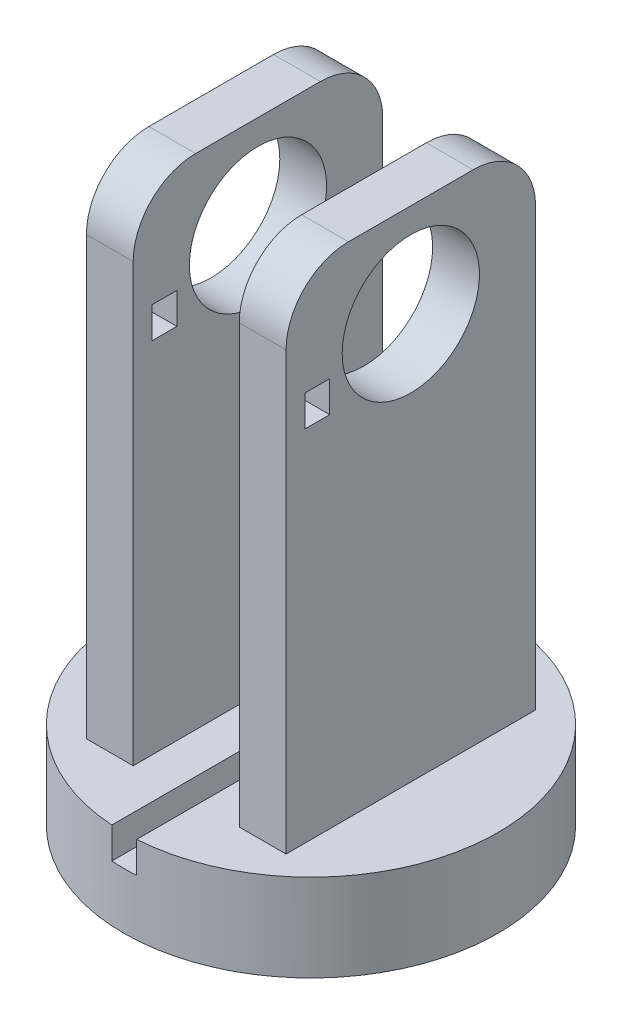
ISO-10303-21;
HEADER;
FILE_DESCRIPTION(('STEP AP214'),'2;1');
FILE_NAME('part.step','',(''),(''),'','','');
FILE_SCHEMA(('AUTOMOTIVE_DESIGN { 1 0 10303 214 1 1 1 1 }'));
ENDSEC;
DATA;
#1=APPLICATION_CONTEXT('core data for automotive mechanical design processes');
#2=APPLICATION_PROTOCOL_DEFINITION('international standard','automotive_design',2000,#1);
#3=PRODUCT_CONTEXT('',#1,'mechanical');
#4=PRODUCT('Part','Part','',(#3));
#5=PRODUCT_RELATED_PRODUCT_CATEGORY('part','',(#4));
#6=PRODUCT_DEFINITION_FORMATION('','',#4);
#7=PRODUCT_DEFINITION_CONTEXT('part definition',#1,'design');
#8=PRODUCT_DEFINITION('design','',#6,#7);
#9=PRODUCT_DEFINITION_SHAPE('','',#8);
#10=(LENGTH_UNIT() NAMED_UNIT(*) SI_UNIT(.MILLI.,.METRE.));
#11=(NAMED_UNIT(*) PLANE_ANGLE_UNIT() SI_UNIT($,.RADIAN.));
#12=(NAMED_UNIT(*) SI_UNIT($,.STERADIAN.) SOLID_ANGLE_UNIT());
#13=UNCERTAINTY_MEASURE_WITH_UNIT(LENGTH_MEASURE(1.E-05),#10,'distance_accuracy_value','');
#14=(GEOMETRIC_REPRESENTATION_CONTEXT(3) GLOBAL_UNCERTAINTY_ASSIGNED_CONTEXT((#13)) GLOBAL_UNIT_ASSIGNED_CONTEXT((#10,
#11,#12)) REPRESENTATION_CONTEXT('',''));
#15=CARTESIAN_POINT('',(0.,0.,0.));
#16=DIRECTION('',(0.,0.,1.));
#17=DIRECTION('',(1.,0.,0.));
#18=AXIS2_PLACEMENT_3D('',#15,#16,#17);
#19=CARTESIAN_POINT('',(0.,14.,0.));
#20=DIRECTION('',(0.,1.,0.));
#21=DIRECTION('',(0.,0.,1.));
#22=AXIS2_PLACEMENT_3D('',#19,#20,#21);
#23=PLANE('',#22);
#24=DIRECTION('',(0.,0.,-1.));
#25=VECTOR('',#24,1.);
#26=CARTESIAN_POINT('',(2.,14.,-29.9332590941915));
#27=LINE('',#26,#25);
#28=CARTESIAN_POINT('',(2.,14.,29.9332590941915));
#29=VERTEX_POINT('',#28);
#30=CARTESIAN_POINT('',(2.,14.,-29.9332590941915));
#31=VERTEX_POINT('',#30);
#32=EDGE_CURVE('E246',#29,#31,#27,.T.);
#33=ORIENTED_EDGE('',*,*,#32,.F.);
#34=CARTESIAN_POINT('',(0.,14.,0.));
#35=DIRECTION('',(0.,1.,0.));
#36=DIRECTION('',(0.,0.,1.));
#37=AXIS2_PLACEMENT_3D('',#34,#35,#36);
#38=CIRCLE('',#37,30.);
#39=EDGE_CURVE('E334',#29,#31,#38,.T.);
#40=ORIENTED_EDGE('',*,*,#39,.T.);
#41=EDGE_LOOP('',(#33,#40));
#42=FACE_BOUND('',#41,.T.);
#43=DIRECTION('',(0.,0.,-1.));
#44=VECTOR('',#43,1.);
#45=CARTESIAN_POINT('',(16.,14.,20.));
#46=LINE('',#45,#44);
#47=CARTESIAN_POINT('',(16.,14.,20.));
#48=VERTEX_POINT('',#47);
#49=CARTESIAN_POINT('',(16.,14.,-20.));
#50=VERTEX_POINT('',#49);
#51=EDGE_CURVE('E286',#48,#50,#46,.T.);
#52=ORIENTED_EDGE('',*,*,#51,.F.);
#53=DIRECTION('',(1.,0.,0.));
#54=VECTOR('',#53,1.);
#55=CARTESIAN_POINT('',(8.5,14.,20.));
#56=LINE('',#55,#54);
#57=CARTESIAN_POINT('',(8.5,14.,20.));
#58=VERTEX_POINT('',#57);
#59=EDGE_CURVE('E275',#58,#48,#56,.T.);
#60=ORIENTED_EDGE('',*,*,#59,.F.);
#61=DIRECTION('',(0.,0.,1.));
#62=VECTOR('',#61,1.);
#63=CARTESIAN_POINT('',(8.5,14.,-20.));
#64=LINE('',#63,#62);
#65=CARTESIAN_POINT('',(8.5,14.,-20.));
#66=VERTEX_POINT('',#65);
#67=EDGE_CURVE('E280',#66,#58,#64,.T.);
#68=ORIENTED_EDGE('',*,*,#67,.F.);
#69=DIRECTION('',(-1.,0.,0.));
#70=VECTOR('',#69,1.);
#71=CARTESIAN_POINT('',(16.,14.,-20.));
#72=LINE('',#71,#70);
#73=EDGE_CURVE('E289',#50,#66,#72,.T.);
#74=ORIENTED_EDGE('',*,*,#73,.F.);
#75=EDGE_LOOP('',(#52,#60,#68,#74));
#76=FACE_BOUND('',#75,.T.);
#77=ADVANCED_FACE('F33',(#42,#76),#23,.T.);
#78=DIRECTION('',(0.,0.,1.));
#79=VECTOR('',#78,1.);
#80=CARTESIAN_POINT('',(-2.,14.,-29.9332590941915));
#81=LINE('',#80,#79);
#82=CARTESIAN_POINT('',(-2.,14.,-29.9332590941915));
#83=VERTEX_POINT('',#82);
#84=CARTESIAN_POINT('',(-2.,14.,29.9332590941915));
#85=VERTEX_POINT('',#84);
#86=EDGE_CURVE('E241',#83,#85,#81,.T.);
#87=ORIENTED_EDGE('',*,*,#86,.F.);
#88=EDGE_CURVE('E338',#83,#85,#38,.T.);
#89=ORIENTED_EDGE('',*,*,#88,.T.);
#90=EDGE_LOOP('',(#87,#89));
#91=FACE_BOUND('',#90,.T.);
#92=DIRECTION('',(0.,0.,-1.));
#93=VECTOR('',#92,1.);
#94=CARTESIAN_POINT('',(-8.5,14.,20.));
#95=LINE('',#94,#93);
#96=CARTESIAN_POINT('',(-8.5,14.,20.));
#97=VERTEX_POINT('',#96);
#98=CARTESIAN_POINT('',(-8.5,14.,-20.));
#99=VERTEX_POINT('',#98);
#100=EDGE_CURVE('E312',#97,#99,#95,.T.);
#101=ORIENTED_EDGE('',*,*,#100,.F.);
#102=DIRECTION('',(1.,0.,0.));
#103=VECTOR('',#102,1.);
#104=CARTESIAN_POINT('',(-16.,14.,20.));
#105=LINE('',#104,#103);
#106=CARTESIAN_POINT('',(-16.,14.,20.));
#107=VERTEX_POINT('',#106);
#108=EDGE_CURVE('E301',#107,#97,#105,.T.);
#109=ORIENTED_EDGE('',*,*,#108,.F.);
#110=DIRECTION('',(0.,0.,1.));
#111=VECTOR('',#110,1.);
#112=CARTESIAN_POINT('',(-16.,14.,-20.));
#113=LINE('',#112,#111);
#114=CARTESIAN_POINT('',(-16.,14.,-20.));
#115=VERTEX_POINT('',#114);
#116=EDGE_CURVE('E306',#115,#107,#113,.T.);
#117=ORIENTED_EDGE('',*,*,#116,.F.);
#118=DIRECTION('',(-1.,0.,0.));
#119=VECTOR('',#118,1.);
#120=CARTESIAN_POINT('',(-8.5,14.,-20.));
#121=LINE('',#120,#119);
#122=EDGE_CURVE('E315',#99,#115,#121,.T.);
#123=ORIENTED_EDGE('',*,*,#122,.F.);
#124=EDGE_LOOP('',(#101,#109,#117,#123));
#125=FACE_BOUND('',#124,.T.);
#126=ADVANCED_FACE('F450',(#91,#125),#23,.T.);
#127=CARTESIAN_POINT('',(0.,14.,0.));
#128=DIRECTION('',(0.,-1.,0.));
#129=DIRECTION('',(0.,0.,-1.));
#130=AXIS2_PLACEMENT_3D('',#127,#128,#129);
#131=CYLINDRICAL_SURFACE('',#130,30.);
#132=CARTESIAN_POINT('',(0.,9.,0.));
#133=DIRECTION('',(0.,1.,0.));
#134=DIRECTION('',(0.,0.,1.));
#135=AXIS2_PLACEMENT_3D('',#132,#133,#134);
#136=CIRCLE('',#135,30.);
#137=CARTESIAN_POINT('',(2.,9.,-29.9332590941915));
#138=VERTEX_POINT('',#137);
#139=CARTESIAN_POINT('',(-2.,9.,-29.9332590941915));
#140=VERTEX_POINT('',#139);
#141=EDGE_CURVE('E242',#138,#140,#136,.T.);
#142=ORIENTED_EDGE('',*,*,#141,.F.);
#143=DIRECTION('',(0.,1.,0.));
#144=VECTOR('',#143,1.);
#145=CARTESIAN_POINT('',(2.,9.,-29.9332590941915));
#146=LINE('',#145,#144);
#147=EDGE_CURVE('E256',#138,#31,#146,.T.);
#148=ORIENTED_EDGE('',*,*,#147,.T.);
#149=ORIENTED_EDGE('',*,*,#39,.F.);
#150=DIRECTION('',(0.,1.,0.));
#151=VECTOR('',#150,1.);
#152=CARTESIAN_POINT('',(2.,9.,29.9332590941915));
#153=LINE('',#152,#151);
#154=CARTESIAN_POINT('',(2.,9.,29.9332590941915));
#155=VERTEX_POINT('',#154);
#156=EDGE_CURVE('E260',#155,#29,#153,.T.);
#157=ORIENTED_EDGE('',*,*,#156,.F.);
#158=CARTESIAN_POINT('',(0.,9.,0.));
#159=DIRECTION('',(0.,1.,0.));
#160=DIRECTION('',(0.,0.,1.));
#161=AXIS2_PLACEMENT_3D('',#158,#159,#160);
#162=CIRCLE('',#161,30.);
#163=CARTESIAN_POINT('',(-2.,9.,29.9332590941915));
#164=VERTEX_POINT('',#163);
#165=EDGE_CURVE('E248',#164,#155,#162,.T.);
#166=ORIENTED_EDGE('',*,*,#165,.F.);
#167=DIRECTION('',(0.,1.,0.));
#168=VECTOR('',#167,1.);
#169=CARTESIAN_POINT('',(-2.,9.,29.9332590941915));
#170=LINE('',#169,#168);
#171=EDGE_CURVE('E262',#164,#85,#170,.T.);
#172=ORIENTED_EDGE('',*,*,#171,.T.);
#173=ORIENTED_EDGE('',*,*,#88,.F.);
#174=DIRECTION('',(0.,1.,0.));
#175=VECTOR('',#174,1.);
#176=CARTESIAN_POINT('',(-2.,9.,-29.9332590941915));
#177=LINE('',#176,#175);
#178=EDGE_CURVE('E253',#140,#83,#177,.T.);
#179=ORIENTED_EDGE('',*,*,#178,.F.);
#180=EDGE_LOOP('',(#142,#148,#149,#157,#166,#172,#173,#179));
#181=FACE_BOUND('',#180,.T.);
#182=CARTESIAN_POINT('',(0.,0.,0.));
#183=DIRECTION('',(0.,1.,0.));
#184=DIRECTION('',(0.,0.,1.));
#185=AXIS2_PLACEMENT_3D('',#182,#183,#184);
#186=CIRCLE('',#185,30.);
#187=CARTESIAN_POINT('',(0.,0.,30.));
#188=VERTEX_POINT('',#187);
#189=EDGE_CURVE('E331',#188,#188,#186,.T.);
#190=ORIENTED_EDGE('',*,*,#189,.T.);
#191=EDGE_LOOP('',(#190));
#192=FACE_BOUND('',#191,.T.);
#193=ADVANCED_FACE('F456',(#181,#192),#131,.T.);
#194=CARTESIAN_POINT('',(0.,0.,0.));
#195=DIRECTION('',(0.,1.,0.));
#196=DIRECTION('',(0.,0.,1.));
#197=AXIS2_PLACEMENT_3D('',#194,#195,#196);
#198=PLANE('',#197);
#199=CARTESIAN_POINT('',(0.,0.,0.));
#200=DIRECTION('',(0.,-1.,0.));
#201=DIRECTION('',(0.,0.,-1.));
#202=AXIS2_PLACEMENT_3D('',#199,#200,#201);
#203=CIRCLE('',#202,11.05);
#204=CARTESIAN_POINT('',(0.,0.,-11.05));
#205=VERTEX_POINT('',#204);
#206=EDGE_CURVE('E327',#205,#205,#203,.T.);
#207=ORIENTED_EDGE('',*,*,#206,.F.);
#208=EDGE_LOOP('',(#207));
#209=FACE_BOUND('',#208,.T.);
#210=ORIENTED_EDGE('',*,*,#189,.F.);
#211=EDGE_LOOP('',(#210));
#212=FACE_BOUND('',#211,.T.);
#213=ADVANCED_FACE('F463',(#209,#212),#198,.F.);
#214=CARTESIAN_POINT('',(0.,7.,0.));
#215=DIRECTION('',(0.,-1.,0.));
#216=DIRECTION('',(0.,0.,-1.));
#217=AXIS2_PLACEMENT_3D('',#214,#215,#216);
#218=CYLINDRICAL_SURFACE('',#217,11.05);
#219=CARTESIAN_POINT('',(0.,7.,0.));
#220=DIRECTION('',(0.,-1.,0.));
#221=DIRECTION('',(0.,0.,-1.));
#222=AXIS2_PLACEMENT_3D('',#219,#220,#221);
#223=CIRCLE('',#222,11.05);
#224=CARTESIAN_POINT('',(0.,7.,-11.05));
#225=VERTEX_POINT('',#224);
#226=EDGE_CURVE('E328',#225,#225,#223,.T.);
#227=CARTESIAN_POINT('',(0.,7.,-11.05));
#228=CARTESIAN_POINT('',(0.,6.92708333333333,-11.05));
#229=CARTESIAN_POINT('',(0.,6.85416666666667,-11.05));
#230=CARTESIAN_POINT('',(0.,6.70833333333333,-11.05));
#231=CARTESIAN_POINT('',(0.,6.63541666666667,-11.05));
#232=CARTESIAN_POINT('',(0.,6.48958333333333,-11.05));
#233=CARTESIAN_POINT('',(0.,6.41666666666667,-11.05));
#234=CARTESIAN_POINT('',(0.,6.27083333333333,-11.05));
#235=CARTESIAN_POINT('',(0.,6.19791666666667,-11.05));
#236=CARTESIAN_POINT('',(0.,6.05208333333333,-11.05));
#237=CARTESIAN_POINT('',(0.,5.97916666666667,-11.05));
#238=CARTESIAN_POINT('',(0.,5.83333333333333,-11.05));
#239=CARTESIAN_POINT('',(0.,5.76041666666667,-11.05));
#240=CARTESIAN_POINT('',(0.,5.61458333333333,-11.05));
#241=CARTESIAN_POINT('',(0.,5.54166666666667,-11.05));
#242=CARTESIAN_POINT('',(0.,5.39583333333333,-11.05));
#243=CARTESIAN_POINT('',(0.,5.32291666666667,-11.05));
#244=CARTESIAN_POINT('',(0.,5.17708333333333,-11.05));
#245=CARTESIAN_POINT('',(0.,5.10416666666667,-11.05));
#246=CARTESIAN_POINT('',(0.,4.95833333333333,-11.05));
#247=CARTESIAN_POINT('',(0.,4.88541666666667,-11.05));
#248=CARTESIAN_POINT('',(0.,4.73958333333333,-11.05));
#249=CARTESIAN_POINT('',(0.,4.66666666666667,-11.05));
#250=CARTESIAN_POINT('',(0.,4.52083333333333,-11.05));
#251=CARTESIAN_POINT('',(0.,4.44791666666667,-11.05));
#252=CARTESIAN_POINT('',(0.,4.30208333333333,-11.05));
#253=CARTESIAN_POINT('',(0.,4.22916666666667,-11.05));
#254=CARTESIAN_POINT('',(0.,4.08333333333333,-11.05));
#255=CARTESIAN_POINT('',(0.,4.01041666666667,-11.05));
#256=CARTESIAN_POINT('',(0.,3.86458333333333,-11.05));
#257=CARTESIAN_POINT('',(0.,3.79166666666667,-11.05));
#258=CARTESIAN_POINT('',(0.,3.64583333333333,-11.05));
#259=CARTESIAN_POINT('',(0.,3.57291666666667,-11.05));
#260=CARTESIAN_POINT('',(0.,3.42708333333333,-11.05));
#261=CARTESIAN_POINT('',(0.,3.35416666666667,-11.05));
#262=CARTESIAN_POINT('',(0.,3.20833333333333,-11.05));
#263=CARTESIAN_POINT('',(0.,3.13541666666667,-11.05));
#264=CARTESIAN_POINT('',(0.,2.98958333333333,-11.05));
#265=CARTESIAN_POINT('',(0.,2.91666666666667,-11.05));
#266=CARTESIAN_POINT('',(0.,2.77083333333333,-11.05));
#267=CARTESIAN_POINT('',(0.,2.69791666666667,-11.05));
#268=CARTESIAN_POINT('',(0.,2.55208333333333,-11.05));
#269=CARTESIAN_POINT('',(0.,2.47916666666667,-11.05));
#270=CARTESIAN_POINT('',(0.,2.33333333333333,-11.05));
#271=CARTESIAN_POINT('',(0.,2.26041666666667,-11.05));
#272=CARTESIAN_POINT('',(0.,2.11458333333333,-11.05));
#273=CARTESIAN_POINT('',(0.,2.04166666666667,-11.05));
#274=CARTESIAN_POINT('',(0.,1.89583333333333,-11.05));
#275=CARTESIAN_POINT('',(0.,1.82291666666667,-11.05));
#276=CARTESIAN_POINT('',(0.,1.67708333333333,-11.05));
#277=CARTESIAN_POINT('',(0.,1.60416666666667,-11.05));
#278=CARTESIAN_POINT('',(0.,1.45833333333333,-11.05));
#279=CARTESIAN_POINT('',(0.,1.38541666666667,-11.05));
#280=CARTESIAN_POINT('',(0.,1.23958333333333,-11.05));
#281=CARTESIAN_POINT('',(0.,1.16666666666667,-11.05));
#282=CARTESIAN_POINT('',(0.,1.02083333333333,-11.05));
#283=CARTESIAN_POINT('',(0.,0.947916666666668,-11.05));
#284=CARTESIAN_POINT('',(0.,0.802083333333334,-11.05));
#285=CARTESIAN_POINT('',(0.,0.729166666666667,-11.05));
#286=CARTESIAN_POINT('',(0.,0.583333333333334,-11.05));
#287=CARTESIAN_POINT('',(0.,0.510416666666668,-11.05));
#288=CARTESIAN_POINT('',(0.,0.364583333333335,-11.05));
#289=CARTESIAN_POINT('',(0.,0.291666666666668,-11.05));
#290=CARTESIAN_POINT('',(0.,0.145833333333334,-11.05));
#291=CARTESIAN_POINT('',(0.,0.0729166666666675,-11.05));
#292=CARTESIAN_POINT('',(0.,0.,-11.05));
#293=B_SPLINE_CURVE_WITH_KNOTS('',3,(#227,#228,#229,#230,#231,#232,#233,#234,#235,#236,#237,
#238,#239,#240,#241,#242,#243,#244,#245,#246,#247,#248,#249,#250,#251,#252,#253,#254,#255,#256,
#257,#258,#259,#260,#261,#262,#263,#264,#265,#266,#267,#268,#269,#270,#271,#272,#273,#274,#275,
#276,#277,#278,#279,#280,#281,#282,#283,#284,#285,#286,#287,#288,#289,#290,#291,#292),
.UNSPECIFIED.,.F.,.F.,(4,2,2,2,2,2,2,2,2,2,2,2,2,2,2,2,2,2,2,2,2,2,2,2,2,2,2,2,2,2,2,2,4),(0.,
0.21875,0.4375,0.656250000000001,0.875,1.09375,1.3125,1.53125,1.75,1.96875,2.1875,2.40625,2.625,
2.84375,3.0625,3.28125,3.5,3.71875,3.9375,4.15625,4.375,4.59375,4.8125,5.03125,5.25,5.46875,
5.6875,5.90625,6.125,6.34375,6.5625,6.78125,7.),.UNSPECIFIED.);
#294=EDGE_CURVE('BSEAM461',#225,#205,#293,.T.);
#295=ORIENTED_EDGE('',*,*,#226,.F.);
#296=ORIENTED_EDGE('',*,*,#206,.T.);
#297=ORIENTED_EDGE('',*,*,#294,.T.);
#298=ORIENTED_EDGE('',*,*,#294,.F.);
#299=EDGE_LOOP('',(#295,#297,#296,#298));
#300=FACE_BOUND('',#299,.T.);
#301=ADVANCED_FACE('F461',(#300),#218,.F.);
#302=CARTESIAN_POINT('',(0.,7.,0.));
#303=DIRECTION('',(0.,-1.,0.));
#304=DIRECTION('',(0.,0.,-1.));
#305=AXIS2_PLACEMENT_3D('',#302,#303,#304);
#306=PLANE('',#305);
#307=ORIENTED_EDGE('',*,*,#226,.T.);
#308=EDGE_LOOP('',(#307));
#309=FACE_BOUND('',#308,.T.);
#310=ADVANCED_FACE('F521',(#309),#306,.T.);
#311=CARTESIAN_POINT('',(-16.,94.,20.));
#312=DIRECTION('',(0.,0.,-1.));
#313=DIRECTION('',(-1.,0.,0.));
#314=AXIS2_PLACEMENT_3D('',#311,#312,#313);
#315=PLANE('',#314);
#316=DIRECTION('',(0.,-1.,0.));
#317=VECTOR('',#316,1.);
#318=CARTESIAN_POINT('',(-8.5,94.,20.));
#319=LINE('',#318,#317);
#320=CARTESIAN_POINT('',(-8.5,84.,20.));
#321=VERTEX_POINT('',#320);
#322=EDGE_CURVE('E325',#321,#97,#319,.T.);
#323=ORIENTED_EDGE('',*,*,#322,.F.);
#324=DIRECTION('',(1.,0.,0.));
#325=VECTOR('',#324,1.);
#326=CARTESIAN_POINT('',(-16.,84.,20.));
#327=LINE('',#326,#325);
#328=CARTESIAN_POINT('',(-16.,84.,20.));
#329=VERTEX_POINT('',#328);
#330=EDGE_CURVE('E374',#321,#329,#327,.F.);
#331=ORIENTED_EDGE('',*,*,#330,.T.);
#332=DIRECTION('',(0.,-1.,0.));
#333=VECTOR('',#332,1.);
#334=CARTESIAN_POINT('',(-16.,94.,20.));
#335=LINE('',#334,#333);
#336=EDGE_CURVE('E309',#329,#107,#335,.T.);
#337=ORIENTED_EDGE('',*,*,#336,.T.);
#338=ORIENTED_EDGE('',*,*,#108,.T.);
#339=EDGE_LOOP('',(#323,#331,#337,#338));
#340=FACE_BOUND('',#339,.T.);
#341=ADVANCED_FACE('F510',(#340),#315,.F.);
#342=CARTESIAN_POINT('',(-8.5,94.,20.));
#343=DIRECTION('',(-1.,0.,0.));
#344=DIRECTION('',(0.,0.,1.));
#345=AXIS2_PLACEMENT_3D('',#342,#343,#344);
#346=PLANE('',#345);
#347=DIRECTION('',(0.,0.,-1.));
#348=VECTOR('',#347,1.);
#349=CARTESIAN_POINT('',(-8.5,71.5,20.));
#350=LINE('',#349,#348);
#351=CARTESIAN_POINT('',(-8.5,71.5,17.));
#352=VERTEX_POINT('',#351);
#353=CARTESIAN_POINT('',(-8.5,71.5,13.));
#354=VERTEX_POINT('',#353);
#355=EDGE_CURVE('E236',#352,#354,#350,.T.);
#356=ORIENTED_EDGE('',*,*,#355,.F.);
#357=DIRECTION('',(0.,1.,0.));
#358=VECTOR('',#357,1.);
#359=CARTESIAN_POINT('',(-8.5,94.,17.));
#360=LINE('',#359,#358);
#361=CARTESIAN_POINT('',(-8.5,76.5,17.));
#362=VERTEX_POINT('',#361);
#363=EDGE_CURVE('E238',#352,#362,#360,.T.);
#364=ORIENTED_EDGE('',*,*,#363,.T.);
#365=DIRECTION('',(0.,0.,-1.));
#366=VECTOR('',#365,1.);
#367=CARTESIAN_POINT('',(-8.5,76.5,20.));
#368=LINE('',#367,#366);
#369=CARTESIAN_POINT('',(-8.5,76.5,13.));
#370=VERTEX_POINT('',#369);
#371=EDGE_CURVE('E232',#362,#370,#368,.T.);
#372=ORIENTED_EDGE('',*,*,#371,.T.);
#373=DIRECTION('',(0.,1.,0.));
#374=VECTOR('',#373,1.);
#375=CARTESIAN_POINT('',(-8.5,94.,13.));
#376=LINE('',#375,#374);
#377=EDGE_CURVE('E200',#354,#370,#376,.T.);
#378=ORIENTED_EDGE('',*,*,#377,.F.);
#379=EDGE_LOOP('',(#356,#364,#372,#378));
#380=FACE_BOUND('',#379,.T.);
#381=CARTESIAN_POINT('',(-8.5,79.,0.));
#382=DIRECTION('',(-1.,0.,0.));
#383=DIRECTION('',(0.,0.,1.));
#384=AXIS2_PLACEMENT_3D('',#381,#382,#383);
#385=CIRCLE('',#384,11.);
#386=CARTESIAN_POINT('',(-8.5,79.,11.));
#387=VERTEX_POINT('',#386);
#388=EDGE_CURVE('E272',#387,#387,#385,.T.);
#389=ORIENTED_EDGE('',*,*,#388,.T.);
#390=EDGE_LOOP('',(#389));
#391=FACE_BOUND('',#390,.T.);
#392=DIRECTION('',(0.,-1.,0.));
#393=VECTOR('',#392,1.);
#394=CARTESIAN_POINT('',(-8.5,94.,-20.));
#395=LINE('',#394,#393);
#396=CARTESIAN_POINT('',(-8.5,84.,-20.));
#397=VERTEX_POINT('',#396);
#398=EDGE_CURVE('E323',#397,#99,#395,.T.);
#399=ORIENTED_EDGE('',*,*,#398,.F.);
#400=CARTESIAN_POINT('',(-8.5,84.,-10.));
#401=DIRECTION('',(-1.,0.,0.));
#402=DIRECTION('',(0.,0.,1.));
#403=AXIS2_PLACEMENT_3D('',#400,#401,#402);
#404=CIRCLE('',#403,10.);
#405=CARTESIAN_POINT('',(-8.5,94.,-10.));
#406=VERTEX_POINT('',#405);
#407=EDGE_CURVE('E354',#397,#406,#404,.F.);
#408=ORIENTED_EDGE('',*,*,#407,.T.);
#409=DIRECTION('',(0.,0.,-1.));
#410=VECTOR('',#409,1.);
#411=CARTESIAN_POINT('',(-8.5,94.,20.));
#412=LINE('',#411,#410);
#413=CARTESIAN_POINT('',(-8.5,94.,10.));
#414=VERTEX_POINT('',#413);
#415=EDGE_CURVE('E302',#414,#406,#412,.T.);
#416=ORIENTED_EDGE('',*,*,#415,.F.);
#417=CARTESIAN_POINT('',(-8.5,84.,10.));
#418=DIRECTION('',(-1.,0.,0.));
#419=DIRECTION('',(0.,0.,1.));
#420=AXIS2_PLACEMENT_3D('',#417,#418,#419);
#421=CIRCLE('',#420,10.);
#422=EDGE_CURVE('E352',#414,#321,#421,.F.);
#423=ORIENTED_EDGE('',*,*,#422,.T.);
#424=ORIENTED_EDGE('',*,*,#322,.T.);
#425=ORIENTED_EDGE('',*,*,#100,.T.);
#426=EDGE_LOOP('',(#399,#408,#416,#423,#424,#425));
#427=FACE_BOUND('',#426,.T.);
#428=ADVANCED_FACE('F512',(#380,#391,#427),#346,.F.);
#429=CARTESIAN_POINT('',(-8.5,94.,-20.));
#430=DIRECTION('',(0.,0.,1.));
#431=DIRECTION('',(1.,0.,0.));
#432=AXIS2_PLACEMENT_3D('',#429,#430,#431);
#433=PLANE('',#432);
#434=DIRECTION('',(0.,-1.,0.));
#435=VECTOR('',#434,1.);
#436=CARTESIAN_POINT('',(-16.,94.,-20.));
#437=LINE('',#436,#435);
#438=CARTESIAN_POINT('',(-16.,84.,-20.));
#439=VERTEX_POINT('',#438);
#440=EDGE_CURVE('E321',#439,#115,#437,.T.);
#441=ORIENTED_EDGE('',*,*,#440,.F.);
#442=DIRECTION('',(-1.,0.,0.));
#443=VECTOR('',#442,1.);
#444=CARTESIAN_POINT('',(-8.5,84.,-20.));
#445=LINE('',#444,#443);
#446=EDGE_CURVE('E350',#439,#397,#445,.F.);
#447=ORIENTED_EDGE('',*,*,#446,.T.);
#448=ORIENTED_EDGE('',*,*,#398,.T.);
#449=ORIENTED_EDGE('',*,*,#122,.T.);
#450=EDGE_LOOP('',(#441,#447,#448,#449));
#451=FACE_BOUND('',#450,.T.);
#452=ADVANCED_FACE('F501',(#451),#433,.F.);
#453=CARTESIAN_POINT('',(-16.,94.,-20.));
#454=DIRECTION('',(1.,0.,0.));
#455=DIRECTION('',(0.,0.,-1.));
#456=AXIS2_PLACEMENT_3D('',#453,#454,#455);
#457=PLANE('',#456);
#458=DIRECTION('',(0.,0.,-1.));
#459=VECTOR('',#458,1.);
#460=CARTESIAN_POINT('',(-16.,76.5,17.));
#461=LINE('',#460,#459);
#462=CARTESIAN_POINT('',(-16.,76.5,17.));
#463=VERTEX_POINT('',#462);
#464=CARTESIAN_POINT('',(-16.,76.5,13.));
#465=VERTEX_POINT('',#464);
#466=EDGE_CURVE('E206',#463,#465,#461,.T.);
#467=ORIENTED_EDGE('',*,*,#466,.F.);
#468=DIRECTION('',(0.,1.,0.));
#469=VECTOR('',#468,1.);
#470=CARTESIAN_POINT('',(-16.,71.5,17.));
#471=LINE('',#470,#469);
#472=CARTESIAN_POINT('',(-16.,71.5,17.));
#473=VERTEX_POINT('',#472);
#474=EDGE_CURVE('E56',#473,#463,#471,.T.);
#475=ORIENTED_EDGE('',*,*,#474,.F.);
#476=DIRECTION('',(0.,0.,-1.));
#477=VECTOR('',#476,1.);
#478=CARTESIAN_POINT('',(-16.,71.5,17.));
#479=LINE('',#478,#477);
#480=CARTESIAN_POINT('',(-16.,71.5,13.));
#481=VERTEX_POINT('',#480);
#482=EDGE_CURVE('E214',#473,#481,#479,.T.);
#483=ORIENTED_EDGE('',*,*,#482,.T.);
#484=DIRECTION('',(0.,1.,0.));
#485=VECTOR('',#484,1.);
#486=CARTESIAN_POINT('',(-16.,71.5,13.));
#487=LINE('',#486,#485);
#488=EDGE_CURVE('E197',#481,#465,#487,.T.);
#489=ORIENTED_EDGE('',*,*,#488,.T.);
#490=EDGE_LOOP('',(#467,#475,#483,#489));
#491=FACE_BOUND('',#490,.T.);
#492=CARTESIAN_POINT('',(-16.,79.,0.));
#493=DIRECTION('',(1.,0.,0.));
#494=DIRECTION('',(0.,0.,-1.));
#495=AXIS2_PLACEMENT_3D('',#492,#493,#494);
#496=CIRCLE('',#495,11.);
#497=CARTESIAN_POINT('',(-16.,79.,-11.));
#498=VERTEX_POINT('',#497);
#499=EDGE_CURVE('E269',#498,#498,#496,.T.);
#500=ORIENTED_EDGE('',*,*,#499,.T.);
#501=EDGE_LOOP('',(#500));
#502=FACE_BOUND('',#501,.T.);
#503=DIRECTION('',(0.,0.,1.));
#504=VECTOR('',#503,1.);
#505=CARTESIAN_POINT('',(-16.,94.,-20.));
#506=LINE('',#505,#504);
#507=CARTESIAN_POINT('',(-16.,94.,-10.));
#508=VERTEX_POINT('',#507);
#509=CARTESIAN_POINT('',(-16.,94.,10.));
#510=VERTEX_POINT('',#509);
#511=EDGE_CURVE('E305',#508,#510,#506,.T.);
#512=ORIENTED_EDGE('',*,*,#511,.F.);
#513=CARTESIAN_POINT('',(-16.,84.,-10.));
#514=DIRECTION('',(1.,0.,0.));
#515=DIRECTION('',(0.,0.,-1.));
#516=AXIS2_PLACEMENT_3D('',#513,#514,#515);
#517=CIRCLE('',#516,10.);
#518=EDGE_CURVE('E348',#508,#439,#517,.F.);
#519=ORIENTED_EDGE('',*,*,#518,.T.);
#520=ORIENTED_EDGE('',*,*,#440,.T.);
#521=ORIENTED_EDGE('',*,*,#116,.T.);
#522=ORIENTED_EDGE('',*,*,#336,.F.);
#523=CARTESIAN_POINT('',(-16.,84.,10.));
#524=DIRECTION('',(1.,0.,0.));
#525=DIRECTION('',(0.,0.,-1.));
#526=AXIS2_PLACEMENT_3D('',#523,#524,#525);
#527=CIRCLE('',#526,10.);
#528=EDGE_CURVE('E346',#329,#510,#527,.F.);
#529=ORIENTED_EDGE('',*,*,#528,.T.);
#530=EDGE_LOOP('',(#512,#519,#520,#521,#522,#529));
#531=FACE_BOUND('',#530,.T.);
#532=ADVANCED_FACE('F211',(#491,#502,#531),#457,.F.);
#533=CARTESIAN_POINT('',(0.,94.,0.));
#534=DIRECTION('',(0.,1.,0.));
#535=DIRECTION('',(0.,0.,1.));
#536=AXIS2_PLACEMENT_3D('',#533,#534,#535);
#537=PLANE('',#536);
#538=ORIENTED_EDGE('',*,*,#415,.T.);
#539=DIRECTION('',(-1.,0.,0.));
#540=VECTOR('',#539,1.);
#541=CARTESIAN_POINT('',(-16.,94.,-10.));
#542=LINE('',#541,#540);
#543=EDGE_CURVE('E343',#406,#508,#542,.T.);
#544=ORIENTED_EDGE('',*,*,#543,.T.);
#545=ORIENTED_EDGE('',*,*,#511,.T.);
#546=DIRECTION('',(1.,0.,0.));
#547=VECTOR('',#546,1.);
#548=CARTESIAN_POINT('',(-8.50000000000001,94.,10.));
#549=LINE('',#548,#547);
#550=EDGE_CURVE('E337',#510,#414,#549,.T.);
#551=ORIENTED_EDGE('',*,*,#550,.T.);
#552=EDGE_LOOP('',(#538,#544,#545,#551));
#553=FACE_BOUND('',#552,.T.);
#554=ADVANCED_FACE('F494',(#553),#537,.T.);
#555=CARTESIAN_POINT('',(8.5,94.,20.));
#556=DIRECTION('',(0.,0.,-1.));
#557=DIRECTION('',(-1.,0.,0.));
#558=AXIS2_PLACEMENT_3D('',#555,#556,#557);
#559=PLANE('',#558);
#560=DIRECTION('',(0.,-1.,0.));
#561=VECTOR('',#560,1.);
#562=CARTESIAN_POINT('',(16.,94.,20.));
#563=LINE('',#562,#561);
#564=CARTESIAN_POINT('',(16.,84.,20.));
#565=VERTEX_POINT('',#564);
#566=EDGE_CURVE('E299',#565,#48,#563,.T.);
#567=ORIENTED_EDGE('',*,*,#566,.F.);
#568=DIRECTION('',(1.,0.,0.));
#569=VECTOR('',#568,1.);
#570=CARTESIAN_POINT('',(8.5,84.,20.));
#571=LINE('',#570,#569);
#572=CARTESIAN_POINT('',(8.5,84.,20.));
#573=VERTEX_POINT('',#572);
#574=EDGE_CURVE('E372',#565,#573,#571,.F.);
#575=ORIENTED_EDGE('',*,*,#574,.T.);
#576=DIRECTION('',(0.,-1.,0.));
#577=VECTOR('',#576,1.);
#578=CARTESIAN_POINT('',(8.5,94.,20.));
#579=LINE('',#578,#577);
#580=EDGE_CURVE('E283',#573,#58,#579,.T.);
#581=ORIENTED_EDGE('',*,*,#580,.T.);
#582=ORIENTED_EDGE('',*,*,#59,.T.);
#583=EDGE_LOOP('',(#567,#575,#581,#582));
#584=FACE_BOUND('',#583,.T.);
#585=ADVANCED_FACE('F413',(#584),#559,.F.);
#586=CARTESIAN_POINT('',(16.,94.,20.));
#587=DIRECTION('',(-1.,0.,0.));
#588=DIRECTION('',(0.,0.,1.));
#589=AXIS2_PLACEMENT_3D('',#586,#587,#588);
#590=PLANE('',#589);
#591=DIRECTION('',(0.,0.,1.));
#592=VECTOR('',#591,1.);
#593=CARTESIAN_POINT('',(16.,71.5,17.));
#594=LINE('',#593,#592);
#595=CARTESIAN_POINT('',(16.,71.5,13.));
#596=VERTEX_POINT('',#595);
#597=CARTESIAN_POINT('',(16.,71.5,17.));
#598=VERTEX_POINT('',#597);
#599=EDGE_CURVE('E405',#596,#598,#594,.T.);
#600=ORIENTED_EDGE('',*,*,#599,.T.);
#601=DIRECTION('',(0.,-1.,0.));
#602=VECTOR('',#601,1.);
#603=CARTESIAN_POINT('',(16.,71.5,17.));
#604=LINE('',#603,#602);
#605=CARTESIAN_POINT('',(16.,76.5,17.));
#606=VERTEX_POINT('',#605);
#607=EDGE_CURVE('E233',#606,#598,#604,.T.);
#608=ORIENTED_EDGE('',*,*,#607,.F.);
#609=DIRECTION('',(0.,0.,1.));
#610=VECTOR('',#609,1.);
#611=CARTESIAN_POINT('',(16.,76.5,17.));
#612=LINE('',#611,#610);
#613=CARTESIAN_POINT('',(16.,76.5,13.));
#614=VERTEX_POINT('',#613);
#615=EDGE_CURVE('E230',#614,#606,#612,.T.);
#616=ORIENTED_EDGE('',*,*,#615,.F.);
#617=DIRECTION('',(0.,-1.,0.));
#618=VECTOR('',#617,1.);
#619=CARTESIAN_POINT('',(16.,71.5,13.));
#620=LINE('',#619,#618);
#621=EDGE_CURVE('E222',#614,#596,#620,.T.);
#622=ORIENTED_EDGE('',*,*,#621,.T.);
#623=EDGE_LOOP('',(#600,#608,#616,#622));
#624=FACE_BOUND('',#623,.T.);
#625=CARTESIAN_POINT('',(16.,79.,0.));
#626=DIRECTION('',(-1.,0.,0.));
#627=DIRECTION('',(0.,0.,1.));
#628=AXIS2_PLACEMENT_3D('',#625,#626,#627);
#629=CIRCLE('',#628,11.);
#630=CARTESIAN_POINT('',(16.,79.,11.));
#631=VERTEX_POINT('',#630);
#632=EDGE_CURVE('E266',#631,#631,#629,.T.);
#633=ORIENTED_EDGE('',*,*,#632,.T.);
#634=EDGE_LOOP('',(#633));
#635=FACE_BOUND('',#634,.T.);
#636=DIRECTION('',(0.,-1.,0.));
#637=VECTOR('',#636,1.);
#638=CARTESIAN_POINT('',(16.,94.,-20.));
#639=LINE('',#638,#637);
#640=CARTESIAN_POINT('',(16.,84.,-20.));
#641=VERTEX_POINT('',#640);
#642=EDGE_CURVE('E297',#641,#50,#639,.T.);
#643=ORIENTED_EDGE('',*,*,#642,.F.);
#644=CARTESIAN_POINT('',(16.,84.,-10.));
#645=DIRECTION('',(-1.,0.,0.));
#646=DIRECTION('',(0.,0.,1.));
#647=AXIS2_PLACEMENT_3D('',#644,#645,#646);
#648=CIRCLE('',#647,10.);
#649=CARTESIAN_POINT('',(16.,94.,-9.99999999999999));
#650=VERTEX_POINT('',#649);
#651=EDGE_CURVE('E370',#641,#650,#648,.F.);
#652=ORIENTED_EDGE('',*,*,#651,.T.);
#653=DIRECTION('',(0.,0.,-1.));
#654=VECTOR('',#653,1.);
#655=CARTESIAN_POINT('',(16.,94.,20.));
#656=LINE('',#655,#654);
#657=CARTESIAN_POINT('',(16.,94.,10.));
#658=VERTEX_POINT('',#657);
#659=EDGE_CURVE('E276',#658,#650,#656,.T.);
#660=ORIENTED_EDGE('',*,*,#659,.F.);
#661=CARTESIAN_POINT('',(16.,84.,10.));
#662=DIRECTION('',(-1.,0.,0.));
#663=DIRECTION('',(0.,0.,1.));
#664=AXIS2_PLACEMENT_3D('',#661,#662,#663);
#665=CIRCLE('',#664,10.);
#666=EDGE_CURVE('E368',#658,#565,#665,.F.);
#667=ORIENTED_EDGE('',*,*,#666,.T.);
#668=ORIENTED_EDGE('',*,*,#566,.T.);
#669=ORIENTED_EDGE('',*,*,#51,.T.);
#670=EDGE_LOOP('',(#643,#652,#660,#667,#668,#669));
#671=FACE_BOUND('',#670,.T.);
#672=ADVANCED_FACE('F407',(#624,#635,#671),#590,.F.);
#673=CARTESIAN_POINT('',(16.,94.,-20.));
#674=DIRECTION('',(0.,0.,1.));
#675=DIRECTION('',(1.,0.,0.));
#676=AXIS2_PLACEMENT_3D('',#673,#674,#675);
#677=PLANE('',#676);
#678=DIRECTION('',(0.,-1.,0.));
#679=VECTOR('',#678,1.);
#680=CARTESIAN_POINT('',(8.5,94.,-20.));
#681=LINE('',#680,#679);
#682=CARTESIAN_POINT('',(8.5,84.,-20.));
#683=VERTEX_POINT('',#682);
#684=EDGE_CURVE('E295',#683,#66,#681,.T.);
#685=ORIENTED_EDGE('',*,*,#684,.F.);
#686=DIRECTION('',(-1.,0.,0.));
#687=VECTOR('',#686,1.);
#688=CARTESIAN_POINT('',(16.,84.,-20.));
#689=LINE('',#688,#687);
#690=EDGE_CURVE('E366',#683,#641,#689,.F.);
#691=ORIENTED_EDGE('',*,*,#690,.T.);
#692=ORIENTED_EDGE('',*,*,#642,.T.);
#693=ORIENTED_EDGE('',*,*,#73,.T.);
#694=EDGE_LOOP('',(#685,#691,#692,#693));
#695=FACE_BOUND('',#694,.T.);
#696=ADVANCED_FACE('F412',(#695),#677,.F.);
#697=CARTESIAN_POINT('',(8.5,94.,-20.));
#698=DIRECTION('',(1.,0.,0.));
#699=DIRECTION('',(0.,0.,-1.));
#700=AXIS2_PLACEMENT_3D('',#697,#698,#699);
#701=PLANE('',#700);
#702=DIRECTION('',(0.,0.,1.));
#703=VECTOR('',#702,1.);
#704=CARTESIAN_POINT('',(8.5,76.5,-20.));
#705=LINE('',#704,#703);
#706=CARTESIAN_POINT('',(8.5,76.5,13.));
#707=VERTEX_POINT('',#706);
#708=CARTESIAN_POINT('',(8.5,76.5,17.));
#709=VERTEX_POINT('',#708);
#710=EDGE_CURVE('E376',#707,#709,#705,.T.);
#711=ORIENTED_EDGE('',*,*,#710,.T.);
#712=DIRECTION('',(0.,-1.,0.));
#713=VECTOR('',#712,1.);
#714=CARTESIAN_POINT('',(8.5,94.,17.));
#715=LINE('',#714,#713);
#716=CARTESIAN_POINT('',(8.5,71.5,17.));
#717=VERTEX_POINT('',#716);
#718=EDGE_CURVE('E11',#709,#717,#715,.T.);
#719=ORIENTED_EDGE('',*,*,#718,.T.);
#720=DIRECTION('',(0.,0.,1.));
#721=VECTOR('',#720,1.);
#722=CARTESIAN_POINT('',(8.5,71.5,-20.));
#723=LINE('',#722,#721);
#724=CARTESIAN_POINT('',(8.5,71.5,13.));
#725=VERTEX_POINT('',#724);
#726=EDGE_CURVE('E41',#725,#717,#723,.T.);
#727=ORIENTED_EDGE('',*,*,#726,.F.);
#728=DIRECTION('',(0.,-1.,0.));
#729=VECTOR('',#728,1.);
#730=CARTESIAN_POINT('',(8.5,94.,13.));
#731=LINE('',#730,#729);
#732=EDGE_CURVE('E381',#707,#725,#731,.T.);
#733=ORIENTED_EDGE('',*,*,#732,.F.);
#734=EDGE_LOOP('',(#711,#719,#727,#733));
#735=FACE_BOUND('',#734,.T.);
#736=CARTESIAN_POINT('',(8.5,79.,0.));
#737=DIRECTION('',(1.,0.,0.));
#738=DIRECTION('',(0.,0.,-1.));
#739=AXIS2_PLACEMENT_3D('',#736,#737,#738);
#740=CIRCLE('',#739,11.);
#741=CARTESIAN_POINT('',(8.5,79.,-11.));
#742=VERTEX_POINT('',#741);
#743=EDGE_CURVE('E259',#742,#742,#740,.T.);
#744=ORIENTED_EDGE('',*,*,#743,.T.);
#745=EDGE_LOOP('',(#744));
#746=FACE_BOUND('',#745,.T.);
#747=DIRECTION('',(0.,0.,1.));
#748=VECTOR('',#747,1.);
#749=CARTESIAN_POINT('',(8.5,94.,-20.));
#750=LINE('',#749,#748);
#751=CARTESIAN_POINT('',(8.5,94.,-10.));
#752=VERTEX_POINT('',#751);
#753=CARTESIAN_POINT('',(8.5,94.,10.));
#754=VERTEX_POINT('',#753);
#755=EDGE_CURVE('E279',#752,#754,#750,.T.);
#756=ORIENTED_EDGE('',*,*,#755,.F.);
#757=CARTESIAN_POINT('',(8.5,84.,-10.));
#758=DIRECTION('',(1.,0.,0.));
#759=DIRECTION('',(0.,0.,-1.));
#760=AXIS2_PLACEMENT_3D('',#757,#758,#759);
#761=CIRCLE('',#760,10.);
#762=EDGE_CURVE('E364',#752,#683,#761,.F.);
#763=ORIENTED_EDGE('',*,*,#762,.T.);
#764=ORIENTED_EDGE('',*,*,#684,.T.);
#765=ORIENTED_EDGE('',*,*,#67,.T.);
#766=ORIENTED_EDGE('',*,*,#580,.F.);
#767=CARTESIAN_POINT('',(8.5,84.,10.));
#768=DIRECTION('',(1.,0.,0.));
#769=DIRECTION('',(0.,0.,-1.));
#770=AXIS2_PLACEMENT_3D('',#767,#768,#769);
#771=CIRCLE('',#770,10.);
#772=EDGE_CURVE('E362',#573,#754,#771,.F.);
#773=ORIENTED_EDGE('',*,*,#772,.T.);
#774=EDGE_LOOP('',(#756,#763,#764,#765,#766,#773));
#775=FACE_BOUND('',#774,.T.);
#776=ADVANCED_FACE('F395',(#735,#746,#775),#701,.F.);
#777=CARTESIAN_POINT('',(0.,94.,0.));
#778=DIRECTION('',(0.,1.,0.));
#779=DIRECTION('',(0.,0.,1.));
#780=AXIS2_PLACEMENT_3D('',#777,#778,#779);
#781=PLANE('',#780);
#782=ORIENTED_EDGE('',*,*,#659,.T.);
#783=DIRECTION('',(-1.,0.,0.));
#784=VECTOR('',#783,1.);
#785=CARTESIAN_POINT('',(8.49999999999999,94.,-10.));
#786=LINE('',#785,#784);
#787=EDGE_CURVE('E359',#650,#752,#786,.T.);
#788=ORIENTED_EDGE('',*,*,#787,.T.);
#789=ORIENTED_EDGE('',*,*,#755,.T.);
#790=DIRECTION('',(1.,0.,0.));
#791=VECTOR('',#790,1.);
#792=CARTESIAN_POINT('',(16.,94.,10.));
#793=LINE('',#792,#791);
#794=EDGE_CURVE('E356',#754,#658,#793,.T.);
#795=ORIENTED_EDGE('',*,*,#794,.T.);
#796=EDGE_LOOP('',(#782,#788,#789,#795));
#797=FACE_BOUND('',#796,.T.);
#798=ADVANCED_FACE('F429',(#797),#781,.T.);
#799=CARTESIAN_POINT('',(0.,84.,-10.));
#800=DIRECTION('',(1.,0.,0.));
#801=DIRECTION('',(0.,0.,-1.));
#802=AXIS2_PLACEMENT_3D('',#799,#800,#801);
#803=CYLINDRICAL_SURFACE('',#802,10.);
#804=ORIENTED_EDGE('',*,*,#407,.F.);
#805=ORIENTED_EDGE('',*,*,#446,.F.);
#806=ORIENTED_EDGE('',*,*,#518,.F.);
#807=ORIENTED_EDGE('',*,*,#543,.F.);
#808=EDGE_LOOP('',(#804,#805,#806,#807));
#809=FACE_BOUND('',#808,.T.);
#810=ADVANCED_FACE('F470',(#809),#803,.T.);
#811=CARTESIAN_POINT('',(0.,84.,-10.));
#812=DIRECTION('',(1.,0.,0.));
#813=DIRECTION('',(0.,0.,-1.));
#814=AXIS2_PLACEMENT_3D('',#811,#812,#813);
#815=CYLINDRICAL_SURFACE('',#814,10.);
#816=ORIENTED_EDGE('',*,*,#651,.F.);
#817=ORIENTED_EDGE('',*,*,#690,.F.);
#818=ORIENTED_EDGE('',*,*,#762,.F.);
#819=ORIENTED_EDGE('',*,*,#787,.F.);
#820=EDGE_LOOP('',(#816,#817,#818,#819));
#821=FACE_BOUND('',#820,.T.);
#822=ADVANCED_FACE('F426',(#821),#815,.T.);
#823=CARTESIAN_POINT('',(0.,84.,10.));
#824=DIRECTION('',(-1.,0.,0.));
#825=DIRECTION('',(0.,0.,1.));
#826=AXIS2_PLACEMENT_3D('',#823,#824,#825);
#827=CYLINDRICAL_SURFACE('',#826,10.);
#828=ORIENTED_EDGE('',*,*,#772,.F.);
#829=ORIENTED_EDGE('',*,*,#574,.F.);
#830=ORIENTED_EDGE('',*,*,#666,.F.);
#831=ORIENTED_EDGE('',*,*,#794,.F.);
#832=EDGE_LOOP('',(#828,#829,#830,#831));
#833=FACE_BOUND('',#832,.T.);
#834=ADVANCED_FACE('F437',(#833),#827,.T.);
#835=CARTESIAN_POINT('',(0.,84.,10.));
#836=DIRECTION('',(-1.,0.,0.));
#837=DIRECTION('',(0.,0.,1.));
#838=AXIS2_PLACEMENT_3D('',#835,#836,#837);
#839=CYLINDRICAL_SURFACE('',#838,10.);
#840=ORIENTED_EDGE('',*,*,#528,.F.);
#841=ORIENTED_EDGE('',*,*,#330,.F.);
#842=ORIENTED_EDGE('',*,*,#422,.F.);
#843=ORIENTED_EDGE('',*,*,#550,.F.);
#844=EDGE_LOOP('',(#840,#841,#842,#843));
#845=FACE_BOUND('',#844,.T.);
#846=ADVANCED_FACE('F35',(#845),#839,.T.);
#847=CARTESIAN_POINT('',(30.,79.,0.));
#848=DIRECTION('',(-1.,0.,0.));
#849=DIRECTION('',(0.,0.,1.));
#850=AXIS2_PLACEMENT_3D('',#847,#848,#849);
#851=CYLINDRICAL_SURFACE('',#850,11.);
#852=ORIENTED_EDGE('',*,*,#743,.F.);
#853=EDGE_LOOP('',(#852));
#854=FACE_BOUND('',#853,.T.);
#855=ORIENTED_EDGE('',*,*,#632,.F.);
#856=EDGE_LOOP('',(#855));
#857=FACE_BOUND('',#856,.T.);
#858=ADVANCED_FACE('F479',(#854,#857),#851,.F.);
#859=ORIENTED_EDGE('',*,*,#499,.F.);
#860=EDGE_LOOP('',(#859));
#861=FACE_BOUND('',#860,.T.);
#862=ORIENTED_EDGE('',*,*,#388,.F.);
#863=EDGE_LOOP('',(#862));
#864=FACE_BOUND('',#863,.T.);
#865=ADVANCED_FACE('F484',(#861,#864),#851,.F.);
#866=CARTESIAN_POINT('',(2.,9.,-29.9332590941915));
#867=DIRECTION('',(1.,0.,0.));
#868=DIRECTION('',(0.,0.,-1.));
#869=AXIS2_PLACEMENT_3D('',#866,#867,#868);
#870=PLANE('',#869);
#871=ORIENTED_EDGE('',*,*,#32,.T.);
#872=ORIENTED_EDGE('',*,*,#147,.F.);
#873=DIRECTION('',(0.,0.,-1.));
#874=VECTOR('',#873,1.);
#875=CARTESIAN_POINT('',(2.,9.,-29.9332590941915));
#876=LINE('',#875,#874);
#877=EDGE_CURVE('E250',#155,#138,#876,.T.);
#878=ORIENTED_EDGE('',*,*,#877,.F.);
#879=ORIENTED_EDGE('',*,*,#156,.T.);
#880=EDGE_LOOP('',(#871,#872,#878,#879));
#881=FACE_BOUND('',#880,.T.);
#882=ADVANCED_FACE('F569',(#881),#870,.F.);
#883=CARTESIAN_POINT('',(-2.,9.,-29.9332590941915));
#884=DIRECTION('',(-1.,0.,0.));
#885=DIRECTION('',(0.,0.,1.));
#886=AXIS2_PLACEMENT_3D('',#883,#884,#885);
#887=PLANE('',#886);
#888=ORIENTED_EDGE('',*,*,#86,.T.);
#889=ORIENTED_EDGE('',*,*,#171,.F.);
#890=DIRECTION('',(0.,0.,1.));
#891=VECTOR('',#890,1.);
#892=CARTESIAN_POINT('',(-2.,9.,-29.9332590941915));
#893=LINE('',#892,#891);
#894=EDGE_CURVE('E245',#140,#164,#893,.T.);
#895=ORIENTED_EDGE('',*,*,#894,.F.);
#896=ORIENTED_EDGE('',*,*,#178,.T.);
#897=EDGE_LOOP('',(#888,#889,#895,#896));
#898=FACE_BOUND('',#897,.T.);
#899=ADVANCED_FACE('F742',(#898),#887,.F.);
#900=CARTESIAN_POINT('',(0.,9.,0.));
#901=DIRECTION('',(0.,1.,0.));
#902=DIRECTION('',(0.,0.,1.));
#903=AXIS2_PLACEMENT_3D('',#900,#901,#902);
#904=PLANE('',#903);
#905=ORIENTED_EDGE('',*,*,#141,.T.);
#906=ORIENTED_EDGE('',*,*,#894,.T.);
#907=ORIENTED_EDGE('',*,*,#165,.T.);
#908=ORIENTED_EDGE('',*,*,#877,.T.);
#909=EDGE_LOOP('',(#905,#906,#907,#908));
#910=FACE_BOUND('',#909,.T.);
#911=ADVANCED_FACE('F658',(#910),#904,.T.);
#912=CARTESIAN_POINT('',(22.4031242374329,76.5,17.));
#913=DIRECTION('',(0.,1.,0.));
#914=DIRECTION('',(0.,0.,1.));
#915=AXIS2_PLACEMENT_3D('',#912,#913,#914);
#916=PLANE('',#915);
#917=DIRECTION('',(-1.,0.,0.));
#918=VECTOR('',#917,1.);
#919=CARTESIAN_POINT('',(22.4031242374329,76.5,13.));
#920=LINE('',#919,#918);
#921=EDGE_CURVE('E202',#614,#707,#920,.T.);
#922=ORIENTED_EDGE('',*,*,#921,.F.);
#923=ORIENTED_EDGE('',*,*,#615,.T.);
#924=DIRECTION('',(-1.,0.,0.));
#925=VECTOR('',#924,1.);
#926=CARTESIAN_POINT('',(22.4031242374329,76.5,17.));
#927=LINE('',#926,#925);
#928=EDGE_CURVE('E203',#606,#709,#927,.T.);
#929=ORIENTED_EDGE('',*,*,#928,.T.);
#930=ORIENTED_EDGE('',*,*,#710,.F.);
#931=EDGE_LOOP('',(#922,#923,#929,#930));
#932=FACE_BOUND('',#931,.T.);
#933=ADVANCED_FACE('F398',(#932),#916,.F.);
#934=CARTESIAN_POINT('',(22.4031242374329,71.5,13.));
#935=DIRECTION('',(0.,0.,1.));
#936=DIRECTION('',(1.,0.,0.));
#937=AXIS2_PLACEMENT_3D('',#934,#935,#936);
#938=PLANE('',#937);
#939=ORIENTED_EDGE('',*,*,#732,.T.);
#940=DIRECTION('',(-1.,0.,0.));
#941=VECTOR('',#940,1.);
#942=CARTESIAN_POINT('',(22.4031242374329,71.5,13.));
#943=LINE('',#942,#941);
#944=EDGE_CURVE('E224',#596,#725,#943,.T.);
#945=ORIENTED_EDGE('',*,*,#944,.F.);
#946=ORIENTED_EDGE('',*,*,#621,.F.);
#947=ORIENTED_EDGE('',*,*,#921,.T.);
#948=EDGE_LOOP('',(#939,#945,#946,#947));
#949=FACE_BOUND('',#948,.T.);
#950=ADVANCED_FACE('F401',(#949),#938,.T.);
#951=CARTESIAN_POINT('',(22.4031242374329,71.5,17.));
#952=DIRECTION('',(0.,1.,0.));
#953=DIRECTION('',(0.,0.,1.));
#954=AXIS2_PLACEMENT_3D('',#951,#952,#953);
#955=PLANE('',#954);
#956=ORIENTED_EDGE('',*,*,#726,.T.);
#957=DIRECTION('',(-1.,0.,0.));
#958=VECTOR('',#957,1.);
#959=CARTESIAN_POINT('',(22.4031242374329,71.5,17.));
#960=LINE('',#959,#958);
#961=EDGE_CURVE('E219',#598,#717,#960,.T.);
#962=ORIENTED_EDGE('',*,*,#961,.F.);
#963=ORIENTED_EDGE('',*,*,#599,.F.);
#964=ORIENTED_EDGE('',*,*,#944,.T.);
#965=EDGE_LOOP('',(#956,#962,#963,#964));
#966=FACE_BOUND('',#965,.T.);
#967=ADVANCED_FACE('F385',(#966),#955,.T.);
#968=CARTESIAN_POINT('',(22.4031242374329,71.5,17.));
#969=DIRECTION('',(0.,0.,1.));
#970=DIRECTION('',(1.,0.,0.));
#971=AXIS2_PLACEMENT_3D('',#968,#969,#970);
#972=PLANE('',#971);
#973=ORIENTED_EDGE('',*,*,#928,.F.);
#974=ORIENTED_EDGE('',*,*,#607,.T.);
#975=ORIENTED_EDGE('',*,*,#961,.T.);
#976=ORIENTED_EDGE('',*,*,#718,.F.);
#977=EDGE_LOOP('',(#973,#974,#975,#976));
#978=FACE_BOUND('',#977,.T.);
#979=ADVANCED_FACE('F393',(#978),#972,.F.);
#980=EDGE_CURVE('E223',#352,#473,#960,.T.);
#981=ORIENTED_EDGE('',*,*,#980,.T.);
#982=ORIENTED_EDGE('',*,*,#474,.T.);
#983=EDGE_CURVE('E208',#362,#463,#927,.T.);
#984=ORIENTED_EDGE('',*,*,#983,.F.);
#985=ORIENTED_EDGE('',*,*,#363,.F.);
#986=EDGE_LOOP('',(#981,#982,#984,#985));
#987=FACE_BOUND('',#986,.T.);
#988=ADVANCED_FACE('F707',(#987),#972,.F.);
#989=ORIENTED_EDGE('',*,*,#355,.T.);
#990=EDGE_CURVE('E226',#354,#481,#943,.T.);
#991=ORIENTED_EDGE('',*,*,#990,.T.);
#992=ORIENTED_EDGE('',*,*,#482,.F.);
#993=ORIENTED_EDGE('',*,*,#980,.F.);
#994=EDGE_LOOP('',(#989,#991,#992,#993));
#995=FACE_BOUND('',#994,.T.);
#996=ADVANCED_FACE('F699',(#995),#955,.T.);
#997=ORIENTED_EDGE('',*,*,#377,.T.);
#998=EDGE_CURVE('E48',#370,#465,#920,.T.);
#999=ORIENTED_EDGE('',*,*,#998,.T.);
#1000=ORIENTED_EDGE('',*,*,#488,.F.);
#1001=ORIENTED_EDGE('',*,*,#990,.F.);
#1002=EDGE_LOOP('',(#997,#999,#1000,#1001));
#1003=FACE_BOUND('',#1002,.T.);
#1004=ADVANCED_FACE('F194',(#1003),#938,.T.);
#1005=ORIENTED_EDGE('',*,*,#983,.T.);
#1006=ORIENTED_EDGE('',*,*,#466,.T.);
#1007=ORIENTED_EDGE('',*,*,#998,.F.);
#1008=ORIENTED_EDGE('',*,*,#371,.F.);
#1009=EDGE_LOOP('',(#1005,#1006,#1007,#1008));
#1010=FACE_BOUND('',#1009,.T.);
#1011=ADVANCED_FACE('F207',(#1010),#916,.F.);
#1012=CLOSED_SHELL('',(#77,#126,#193,#213,#301,#310,#341,#428,#452,#532,#554,#585,#672,#696,
#776,#798,#810,#822,#834,#846,#858,#865,#882,#899,#911,#933,#950,#967,#979,#988,#996,#1004,#1011));
#1013=MANIFOLD_SOLID_BREP('B2',#1012);
#1014=ADVANCED_BREP_SHAPE_REPRESENTATION('',(#18,#1013),#14);
#1015=SHAPE_DEFINITION_REPRESENTATION(#9,#1014);
ENDSEC;
END-ISO-10303-21;
